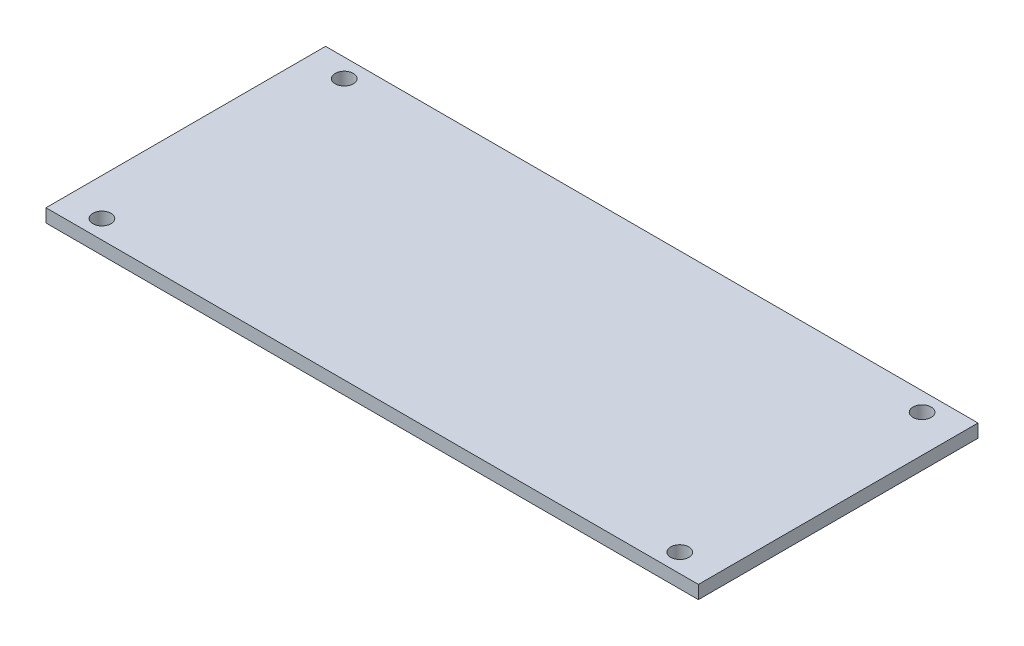
ISO-10303-21;
HEADER;
FILE_DESCRIPTION(('STEP AP214'),'2;1');
FILE_NAME('part.step','',(''),(''),'','','');
FILE_SCHEMA(('AUTOMOTIVE_DESIGN { 1 0 10303 214 1 1 1 1 }'));
ENDSEC;
DATA;
#1=APPLICATION_CONTEXT('core data for automotive mechanical design processes');
#2=APPLICATION_PROTOCOL_DEFINITION('international standard','automotive_design',2000,#1);
#3=PRODUCT_CONTEXT('',#1,'mechanical');
#4=PRODUCT('Part','Part','',(#3));
#5=PRODUCT_RELATED_PRODUCT_CATEGORY('part','',(#4));
#6=PRODUCT_DEFINITION_FORMATION('','',#4);
#7=PRODUCT_DEFINITION_CONTEXT('part definition',#1,'design');
#8=PRODUCT_DEFINITION('design','',#6,#7);
#9=PRODUCT_DEFINITION_SHAPE('','',#8);
#10=(LENGTH_UNIT() NAMED_UNIT(*) SI_UNIT(.MILLI.,.METRE.));
#11=(NAMED_UNIT(*) PLANE_ANGLE_UNIT() SI_UNIT($,.RADIAN.));
#12=(NAMED_UNIT(*) SI_UNIT($,.STERADIAN.) SOLID_ANGLE_UNIT());
#13=UNCERTAINTY_MEASURE_WITH_UNIT(LENGTH_MEASURE(1.E-05),#10,'distance_accuracy_value','');
#14=(GEOMETRIC_REPRESENTATION_CONTEXT(3) GLOBAL_UNCERTAINTY_ASSIGNED_CONTEXT((#13)) GLOBAL_UNIT_ASSIGNED_CONTEXT((#10,
#11,#12)) REPRESENTATION_CONTEXT('',''));
#15=CARTESIAN_POINT('',(0.,0.,0.));
#16=DIRECTION('',(0.,0.,1.));
#17=DIRECTION('',(1.,0.,0.));
#18=AXIS2_PLACEMENT_3D('',#15,#16,#17);
#19=CARTESIAN_POINT('',(0.,1.42,0.));
#20=DIRECTION('',(0.,-1.,0.));
#21=DIRECTION('',(0.,0.,-1.));
#22=AXIS2_PLACEMENT_3D('',#19,#20,#21);
#23=PLANE('',#22);
#24=DIRECTION('',(0.,0.,-1.));
#25=VECTOR('',#24,1.);
#26=CARTESIAN_POINT('',(35.,1.42,15.));
#27=LINE('',#26,#25);
#28=CARTESIAN_POINT('',(35.,1.42,15.));
#29=VERTEX_POINT('',#28);
#30=CARTESIAN_POINT('',(35.,1.42,-15.));
#31=VERTEX_POINT('',#30);
#32=EDGE_CURVE('E85',#29,#31,#27,.T.);
#33=ORIENTED_EDGE('',*,*,#32,.T.);
#34=DIRECTION('',(-1.,0.,0.));
#35=VECTOR('',#34,1.);
#36=CARTESIAN_POINT('',(-35.,1.42,-15.));
#37=LINE('',#36,#35);
#38=CARTESIAN_POINT('',(-35.,1.42,-15.));
#39=VERTEX_POINT('',#38);
#40=EDGE_CURVE('E80',#31,#39,#37,.T.);
#41=ORIENTED_EDGE('',*,*,#40,.T.);
#42=DIRECTION('',(0.,0.,1.));
#43=VECTOR('',#42,1.);
#44=CARTESIAN_POINT('',(-35.,1.42,15.));
#45=LINE('',#44,#43);
#46=CARTESIAN_POINT('',(-35.,1.42,15.));
#47=VERTEX_POINT('',#46);
#48=EDGE_CURVE('E83',#39,#47,#45,.T.);
#49=ORIENTED_EDGE('',*,*,#48,.T.);
#50=DIRECTION('',(1.,0.,0.));
#51=VECTOR('',#50,1.);
#52=CARTESIAN_POINT('',(-35.,1.42,15.));
#53=LINE('',#52,#51);
#54=EDGE_CURVE('E50',#47,#29,#53,.T.);
#55=ORIENTED_EDGE('',*,*,#54,.T.);
#56=EDGE_LOOP('',(#33,#41,#49,#55));
#57=FACE_BOUND('',#56,.T.);
#58=CARTESIAN_POINT('',(-31.,1.42,-13.));
#59=DIRECTION('',(0.,1.,0.));
#60=DIRECTION('',(0.,0.,1.));
#61=AXIS2_PLACEMENT_3D('',#58,#59,#60);
#62=CIRCLE('',#61,0.975);
#63=CARTESIAN_POINT('',(-31.,1.42,-13.975));
#64=VERTEX_POINT('',#63);
#65=EDGE_CURVE('E100',#64,#64,#62,.T.);
#66=ORIENTED_EDGE('',*,*,#65,.F.);
#67=EDGE_LOOP('',(#66));
#68=FACE_BOUND('',#67,.T.);
#69=CARTESIAN_POINT('',(31.,1.42,-13.));
#70=DIRECTION('',(0.,1.,0.));
#71=DIRECTION('',(0.,0.,1.));
#72=AXIS2_PLACEMENT_3D('',#69,#70,#71);
#73=CIRCLE('',#72,0.975000000000003);
#74=CARTESIAN_POINT('',(31.,1.42,-13.975));
#75=VERTEX_POINT('',#74);
#76=EDGE_CURVE('E115',#75,#75,#73,.T.);
#77=ORIENTED_EDGE('',*,*,#76,.F.);
#78=EDGE_LOOP('',(#77));
#79=FACE_BOUND('',#78,.T.);
#80=CARTESIAN_POINT('',(31.,1.42,13.));
#81=DIRECTION('',(0.,1.,0.));
#82=DIRECTION('',(0.,0.,1.));
#83=AXIS2_PLACEMENT_3D('',#80,#81,#82);
#84=CIRCLE('',#83,0.975000000000003);
#85=CARTESIAN_POINT('',(31.,1.42,12.025));
#86=VERTEX_POINT('',#85);
#87=EDGE_CURVE('E121',#86,#86,#84,.T.);
#88=ORIENTED_EDGE('',*,*,#87,.F.);
#89=EDGE_LOOP('',(#88));
#90=FACE_BOUND('',#89,.T.);
#91=CARTESIAN_POINT('',(-31.,1.42,13.));
#92=DIRECTION('',(0.,1.,0.));
#93=DIRECTION('',(0.,0.,1.));
#94=AXIS2_PLACEMENT_3D('',#91,#92,#93);
#95=CIRCLE('',#94,0.975);
#96=CARTESIAN_POINT('',(-31.,1.42,12.025));
#97=VERTEX_POINT('',#96);
#98=EDGE_CURVE('E127',#97,#97,#95,.T.);
#99=ORIENTED_EDGE('',*,*,#98,.F.);
#100=EDGE_LOOP('',(#99));
#101=FACE_BOUND('',#100,.T.);
#102=ADVANCED_FACE('F33',(#57,#68,#79,#90,#101),#23,.F.);
#103=CARTESIAN_POINT('',(0.,0.,0.));
#104=DIRECTION('',(0.,-1.,0.));
#105=DIRECTION('',(0.,0.,-1.));
#106=AXIS2_PLACEMENT_3D('',#103,#104,#105);
#107=PLANE('',#106);
#108=CARTESIAN_POINT('',(31.,0.,13.));
#109=DIRECTION('',(0.,1.,0.));
#110=DIRECTION('',(0.,0.,1.));
#111=AXIS2_PLACEMENT_3D('',#108,#109,#110);
#112=CIRCLE('',#111,0.975000000000003);
#113=CARTESIAN_POINT('',(31.,0.,12.025));
#114=VERTEX_POINT('',#113);
#115=EDGE_CURVE('E124',#114,#114,#112,.T.);
#116=ORIENTED_EDGE('',*,*,#115,.T.);
#117=EDGE_LOOP('',(#116));
#118=FACE_BOUND('',#117,.T.);
#119=CARTESIAN_POINT('',(-31.,0.,-13.));
#120=DIRECTION('',(0.,1.,0.));
#121=DIRECTION('',(0.,0.,1.));
#122=AXIS2_PLACEMENT_3D('',#119,#120,#121);
#123=CIRCLE('',#122,0.975);
#124=CARTESIAN_POINT('',(-31.,0.,-13.975));
#125=VERTEX_POINT('',#124);
#126=EDGE_CURVE('E112',#125,#125,#123,.T.);
#127=ORIENTED_EDGE('',*,*,#126,.T.);
#128=EDGE_LOOP('',(#127));
#129=FACE_BOUND('',#128,.T.);
#130=DIRECTION('',(0.,0.,-1.));
#131=VECTOR('',#130,1.);
#132=CARTESIAN_POINT('',(35.,0.,15.));
#133=LINE('',#132,#131);
#134=CARTESIAN_POINT('',(35.,0.,15.));
#135=VERTEX_POINT('',#134);
#136=CARTESIAN_POINT('',(35.,0.,-15.));
#137=VERTEX_POINT('',#136);
#138=EDGE_CURVE('E97',#135,#137,#133,.T.);
#139=ORIENTED_EDGE('',*,*,#138,.F.);
#140=DIRECTION('',(1.,0.,0.));
#141=VECTOR('',#140,1.);
#142=CARTESIAN_POINT('',(-35.,0.,15.));
#143=LINE('',#142,#141);
#144=CARTESIAN_POINT('',(-35.,0.,15.));
#145=VERTEX_POINT('',#144);
#146=EDGE_CURVE('E73',#145,#135,#143,.T.);
#147=ORIENTED_EDGE('',*,*,#146,.F.);
#148=DIRECTION('',(0.,0.,1.));
#149=VECTOR('',#148,1.);
#150=CARTESIAN_POINT('',(-35.,0.,15.));
#151=LINE('',#150,#149);
#152=CARTESIAN_POINT('',(-35.,0.,-15.));
#153=VERTEX_POINT('',#152);
#154=EDGE_CURVE('E67',#153,#145,#151,.T.);
#155=ORIENTED_EDGE('',*,*,#154,.F.);
#156=DIRECTION('',(-1.,0.,0.));
#157=VECTOR('',#156,1.);
#158=CARTESIAN_POINT('',(-35.,0.,-15.));
#159=LINE('',#158,#157);
#160=EDGE_CURVE('E89',#137,#153,#159,.T.);
#161=ORIENTED_EDGE('',*,*,#160,.F.);
#162=EDGE_LOOP('',(#139,#147,#155,#161));
#163=FACE_BOUND('',#162,.T.);
#164=CARTESIAN_POINT('',(31.,0.,-13.));
#165=DIRECTION('',(0.,1.,0.));
#166=DIRECTION('',(0.,0.,1.));
#167=AXIS2_PLACEMENT_3D('',#164,#165,#166);
#168=CIRCLE('',#167,0.975000000000003);
#169=CARTESIAN_POINT('',(31.,0.,-13.975));
#170=VERTEX_POINT('',#169);
#171=EDGE_CURVE('E118',#170,#170,#168,.T.);
#172=ORIENTED_EDGE('',*,*,#171,.T.);
#173=EDGE_LOOP('',(#172));
#174=FACE_BOUND('',#173,.T.);
#175=CARTESIAN_POINT('',(-31.,0.,13.));
#176=DIRECTION('',(0.,1.,0.));
#177=DIRECTION('',(0.,0.,1.));
#178=AXIS2_PLACEMENT_3D('',#175,#176,#177);
#179=CIRCLE('',#178,0.975);
#180=CARTESIAN_POINT('',(-31.,0.,12.025));
#181=VERTEX_POINT('',#180);
#182=EDGE_CURVE('E130',#181,#181,#179,.T.);
#183=ORIENTED_EDGE('',*,*,#182,.T.);
#184=EDGE_LOOP('',(#183));
#185=FACE_BOUND('',#184,.T.);
#186=ADVANCED_FACE('F108',(#118,#129,#163,#174,#185),#107,.T.);
#187=CARTESIAN_POINT('',(35.,1.42,15.));
#188=DIRECTION('',(-1.,0.,0.));
#189=DIRECTION('',(0.,0.,1.));
#190=AXIS2_PLACEMENT_3D('',#187,#188,#189);
#191=PLANE('',#190);
#192=ORIENTED_EDGE('',*,*,#138,.T.);
#193=DIRECTION('',(0.,-1.,0.));
#194=VECTOR('',#193,1.);
#195=CARTESIAN_POINT('',(35.,1.42,-15.));
#196=LINE('',#195,#194);
#197=EDGE_CURVE('E11',#31,#137,#196,.T.);
#198=ORIENTED_EDGE('',*,*,#197,.F.);
#199=ORIENTED_EDGE('',*,*,#32,.F.);
#200=DIRECTION('',(0.,-1.,0.));
#201=VECTOR('',#200,1.);
#202=CARTESIAN_POINT('',(35.,1.42,15.));
#203=LINE('',#202,#201);
#204=EDGE_CURVE('E93',#29,#135,#203,.T.);
#205=ORIENTED_EDGE('',*,*,#204,.T.);
#206=EDGE_LOOP('',(#192,#198,#199,#205));
#207=FACE_BOUND('',#206,.T.);
#208=ADVANCED_FACE('F35',(#207),#191,.F.);
#209=CARTESIAN_POINT('',(-35.,1.42,-15.));
#210=DIRECTION('',(0.,0.,1.));
#211=DIRECTION('',(1.,0.,0.));
#212=AXIS2_PLACEMENT_3D('',#209,#210,#211);
#213=PLANE('',#212);
#214=ORIENTED_EDGE('',*,*,#160,.T.);
#215=DIRECTION('',(0.,-1.,0.));
#216=VECTOR('',#215,1.);
#217=CARTESIAN_POINT('',(-35.,1.42,-15.));
#218=LINE('',#217,#216);
#219=EDGE_CURVE('E42',#39,#153,#218,.T.);
#220=ORIENTED_EDGE('',*,*,#219,.F.);
#221=ORIENTED_EDGE('',*,*,#40,.F.);
#222=ORIENTED_EDGE('',*,*,#197,.T.);
#223=EDGE_LOOP('',(#214,#220,#221,#222));
#224=FACE_BOUND('',#223,.T.);
#225=ADVANCED_FACE('F88',(#224),#213,.F.);
#226=CARTESIAN_POINT('',(-35.,1.42,15.));
#227=DIRECTION('',(1.,0.,0.));
#228=DIRECTION('',(0.,0.,-1.));
#229=AXIS2_PLACEMENT_3D('',#226,#227,#228);
#230=PLANE('',#229);
#231=ORIENTED_EDGE('',*,*,#154,.T.);
#232=DIRECTION('',(0.,-1.,0.));
#233=VECTOR('',#232,1.);
#234=CARTESIAN_POINT('',(-35.,1.42,15.));
#235=LINE('',#234,#233);
#236=EDGE_CURVE('E90',#47,#145,#235,.T.);
#237=ORIENTED_EDGE('',*,*,#236,.F.);
#238=ORIENTED_EDGE('',*,*,#48,.F.);
#239=ORIENTED_EDGE('',*,*,#219,.T.);
#240=EDGE_LOOP('',(#231,#237,#238,#239));
#241=FACE_BOUND('',#240,.T.);
#242=ADVANCED_FACE('F91',(#241),#230,.F.);
#243=CARTESIAN_POINT('',(-35.,1.42,15.));
#244=DIRECTION('',(0.,0.,-1.));
#245=DIRECTION('',(-1.,0.,0.));
#246=AXIS2_PLACEMENT_3D('',#243,#244,#245);
#247=PLANE('',#246);
#248=ORIENTED_EDGE('',*,*,#146,.T.);
#249=ORIENTED_EDGE('',*,*,#204,.F.);
#250=ORIENTED_EDGE('',*,*,#54,.F.);
#251=ORIENTED_EDGE('',*,*,#236,.T.);
#252=EDGE_LOOP('',(#248,#249,#250,#251));
#253=FACE_BOUND('',#252,.T.);
#254=ADVANCED_FACE('F105',(#253),#247,.F.);
#255=CARTESIAN_POINT('',(-31.,1.42,-13.));
#256=DIRECTION('',(0.,-1.,0.));
#257=DIRECTION('',(0.,0.,-1.));
#258=AXIS2_PLACEMENT_3D('',#255,#256,#257);
#259=CYLINDRICAL_SURFACE('',#258,0.975);
#260=CARTESIAN_POINT('',(-31.,1.42,-13.975));
#261=CARTESIAN_POINT('',(-31.,1.40520833333333,-13.975));
#262=CARTESIAN_POINT('',(-31.,1.39041666666667,-13.975));
#263=CARTESIAN_POINT('',(-31.,1.36083333333333,-13.975));
#264=CARTESIAN_POINT('',(-31.,1.34604166666667,-13.975));
#265=CARTESIAN_POINT('',(-31.,1.31645833333333,-13.975));
#266=CARTESIAN_POINT('',(-31.,1.30166666666667,-13.975));
#267=CARTESIAN_POINT('',(-31.,1.27208333333333,-13.975));
#268=CARTESIAN_POINT('',(-31.,1.25729166666667,-13.975));
#269=CARTESIAN_POINT('',(-31.,1.22770833333333,-13.975));
#270=CARTESIAN_POINT('',(-31.,1.21291666666667,-13.975));
#271=CARTESIAN_POINT('',(-31.,1.18333333333333,-13.975));
#272=CARTESIAN_POINT('',(-31.,1.16854166666667,-13.975));
#273=CARTESIAN_POINT('',(-31.,1.13895833333333,-13.975));
#274=CARTESIAN_POINT('',(-31.,1.12416666666667,-13.975));
#275=CARTESIAN_POINT('',(-31.,1.09458333333333,-13.975));
#276=CARTESIAN_POINT('',(-31.,1.07979166666667,-13.975));
#277=CARTESIAN_POINT('',(-31.,1.05020833333333,-13.975));
#278=CARTESIAN_POINT('',(-31.,1.03541666666667,-13.975));
#279=CARTESIAN_POINT('',(-31.,1.00583333333333,-13.975));
#280=CARTESIAN_POINT('',(-31.,0.991041666666666,-13.975));
#281=CARTESIAN_POINT('',(-31.,0.961458333333333,-13.975));
#282=CARTESIAN_POINT('',(-31.,0.946666666666666,-13.975));
#283=CARTESIAN_POINT('',(-31.,0.917083333333333,-13.975));
#284=CARTESIAN_POINT('',(-31.,0.902291666666666,-13.975));
#285=CARTESIAN_POINT('',(-31.,0.872708333333333,-13.975));
#286=CARTESIAN_POINT('',(-31.,0.857916666666666,-13.975));
#287=CARTESIAN_POINT('',(-31.,0.828333333333333,-13.975));
#288=CARTESIAN_POINT('',(-31.,0.813541666666666,-13.975));
#289=CARTESIAN_POINT('',(-31.,0.783958333333333,-13.975));
#290=CARTESIAN_POINT('',(-31.,0.769166666666666,-13.975));
#291=CARTESIAN_POINT('',(-31.,0.739583333333333,-13.975));
#292=CARTESIAN_POINT('',(-31.,0.724791666666666,-13.975));
#293=CARTESIAN_POINT('',(-31.,0.695208333333333,-13.975));
#294=CARTESIAN_POINT('',(-31.,0.680416666666666,-13.975));
#295=CARTESIAN_POINT('',(-31.,0.650833333333333,-13.975));
#296=CARTESIAN_POINT('',(-31.,0.636041666666666,-13.975));
#297=CARTESIAN_POINT('',(-31.,0.606458333333333,-13.975));
#298=CARTESIAN_POINT('',(-31.,0.591666666666666,-13.975));
#299=CARTESIAN_POINT('',(-31.,0.562083333333333,-13.975));
#300=CARTESIAN_POINT('',(-31.,0.547291666666666,-13.975));
#301=CARTESIAN_POINT('',(-31.,0.517708333333333,-13.975));
#302=CARTESIAN_POINT('',(-31.,0.502916666666666,-13.975));
#303=CARTESIAN_POINT('',(-31.,0.473333333333333,-13.975));
#304=CARTESIAN_POINT('',(-31.,0.458541666666666,-13.975));
#305=CARTESIAN_POINT('',(-31.,0.428958333333333,-13.975));
#306=CARTESIAN_POINT('',(-31.,0.414166666666666,-13.975));
#307=CARTESIAN_POINT('',(-31.,0.384583333333333,-13.975));
#308=CARTESIAN_POINT('',(-31.,0.369791666666666,-13.975));
#309=CARTESIAN_POINT('',(-31.,0.340208333333333,-13.975));
#310=CARTESIAN_POINT('',(-31.,0.325416666666667,-13.975));
#311=CARTESIAN_POINT('',(-31.,0.295833333333333,-13.975));
#312=CARTESIAN_POINT('',(-31.,0.281041666666666,-13.975));
#313=CARTESIAN_POINT('',(-31.,0.251458333333333,-13.975));
#314=CARTESIAN_POINT('',(-31.,0.236666666666666,-13.975));
#315=CARTESIAN_POINT('',(-31.,0.207083333333333,-13.975));
#316=CARTESIAN_POINT('',(-31.,0.192291666666667,-13.975));
#317=CARTESIAN_POINT('',(-31.,0.162708333333333,-13.975));
#318=CARTESIAN_POINT('',(-31.,0.147916666666667,-13.975));
#319=CARTESIAN_POINT('',(-31.,0.118333333333333,-13.975));
#320=CARTESIAN_POINT('',(-31.,0.103541666666666,-13.975));
#321=CARTESIAN_POINT('',(-31.,0.0739583333333331,-13.975));
#322=CARTESIAN_POINT('',(-31.,0.0591666666666664,-13.975));
#323=CARTESIAN_POINT('',(-31.,0.0295833333333331,-13.975));
#324=CARTESIAN_POINT('',(-31.,0.0147916666666664,-13.975));
#325=CARTESIAN_POINT('',(-31.,0.,-13.975));
#326=B_SPLINE_CURVE_WITH_KNOTS('',3,(#260,#261,#262,#263,#264,#265,#266,#267,#268,#269,#270,
#271,#272,#273,#274,#275,#276,#277,#278,#279,#280,#281,#282,#283,#284,#285,#286,#287,#288,#289,
#290,#291,#292,#293,#294,#295,#296,#297,#298,#299,#300,#301,#302,#303,#304,#305,#306,#307,#308,
#309,#310,#311,#312,#313,#314,#315,#316,#317,#318,#319,#320,#321,#322,#323,#324,#325),
.UNSPECIFIED.,.F.,.F.,(4,2,2,2,2,2,2,2,2,2,2,2,2,2,2,2,2,2,2,2,2,2,2,2,2,2,2,2,2,2,2,2,4),(0.,
0.0443750000000001,0.0887500000000001,0.133125,0.1775,0.221875,0.26625,0.310625,0.355,0.399375,
0.44375,0.488125,0.5325,0.576875,0.62125,0.665625,0.71,0.754375,0.79875,0.843125,0.8875,
0.931875,0.97625,1.020625,1.065,1.109375,1.15375,1.198125,1.2425,1.286875,1.33125,1.375625,
1.42),.UNSPECIFIED.);
#327=EDGE_CURVE('BSEAM147',#64,#125,#326,.T.);
#328=ORIENTED_EDGE('',*,*,#65,.T.);
#329=ORIENTED_EDGE('',*,*,#126,.F.);
#330=ORIENTED_EDGE('',*,*,#327,.T.);
#331=ORIENTED_EDGE('',*,*,#327,.F.);
#332=EDGE_LOOP('',(#328,#330,#329,#331));
#333=FACE_BOUND('',#332,.T.);
#334=ADVANCED_FACE('F147',(#333),#259,.F.);
#335=CARTESIAN_POINT('',(31.,1.42,-13.));
#336=DIRECTION('',(0.,-1.,0.));
#337=DIRECTION('',(0.,0.,-1.));
#338=AXIS2_PLACEMENT_3D('',#335,#336,#337);
#339=CYLINDRICAL_SURFACE('',#338,0.975000000000003);
#340=CARTESIAN_POINT('',(31.,1.42,-13.975));
#341=CARTESIAN_POINT('',(31.,1.40520833333333,-13.975));
#342=CARTESIAN_POINT('',(31.,1.39041666666667,-13.975));
#343=CARTESIAN_POINT('',(31.,1.36083333333333,-13.975));
#344=CARTESIAN_POINT('',(31.,1.34604166666667,-13.975));
#345=CARTESIAN_POINT('',(31.,1.31645833333333,-13.975));
#346=CARTESIAN_POINT('',(31.,1.30166666666667,-13.975));
#347=CARTESIAN_POINT('',(31.,1.27208333333333,-13.975));
#348=CARTESIAN_POINT('',(31.,1.25729166666667,-13.975));
#349=CARTESIAN_POINT('',(31.,1.22770833333333,-13.975));
#350=CARTESIAN_POINT('',(31.,1.21291666666667,-13.975));
#351=CARTESIAN_POINT('',(31.,1.18333333333333,-13.975));
#352=CARTESIAN_POINT('',(31.,1.16854166666667,-13.975));
#353=CARTESIAN_POINT('',(31.,1.13895833333333,-13.975));
#354=CARTESIAN_POINT('',(31.,1.12416666666667,-13.975));
#355=CARTESIAN_POINT('',(31.,1.09458333333333,-13.975));
#356=CARTESIAN_POINT('',(31.,1.07979166666667,-13.975));
#357=CARTESIAN_POINT('',(31.,1.05020833333333,-13.975));
#358=CARTESIAN_POINT('',(31.,1.03541666666667,-13.975));
#359=CARTESIAN_POINT('',(31.,1.00583333333333,-13.975));
#360=CARTESIAN_POINT('',(31.,0.991041666666666,-13.975));
#361=CARTESIAN_POINT('',(31.,0.961458333333333,-13.975));
#362=CARTESIAN_POINT('',(31.,0.946666666666666,-13.975));
#363=CARTESIAN_POINT('',(31.,0.917083333333333,-13.975));
#364=CARTESIAN_POINT('',(31.,0.902291666666666,-13.975));
#365=CARTESIAN_POINT('',(31.,0.872708333333333,-13.975));
#366=CARTESIAN_POINT('',(31.,0.857916666666666,-13.975));
#367=CARTESIAN_POINT('',(31.,0.828333333333333,-13.975));
#368=CARTESIAN_POINT('',(31.,0.813541666666666,-13.975));
#369=CARTESIAN_POINT('',(31.,0.783958333333333,-13.975));
#370=CARTESIAN_POINT('',(31.,0.769166666666666,-13.975));
#371=CARTESIAN_POINT('',(31.,0.739583333333333,-13.975));
#372=CARTESIAN_POINT('',(31.,0.724791666666666,-13.975));
#373=CARTESIAN_POINT('',(31.,0.695208333333333,-13.975));
#374=CARTESIAN_POINT('',(31.,0.680416666666666,-13.975));
#375=CARTESIAN_POINT('',(31.,0.650833333333333,-13.975));
#376=CARTESIAN_POINT('',(31.,0.636041666666666,-13.975));
#377=CARTESIAN_POINT('',(31.,0.606458333333333,-13.975));
#378=CARTESIAN_POINT('',(31.,0.591666666666666,-13.975));
#379=CARTESIAN_POINT('',(31.,0.562083333333333,-13.975));
#380=CARTESIAN_POINT('',(31.,0.547291666666666,-13.975));
#381=CARTESIAN_POINT('',(31.,0.517708333333333,-13.975));
#382=CARTESIAN_POINT('',(31.,0.502916666666666,-13.975));
#383=CARTESIAN_POINT('',(31.,0.473333333333333,-13.975));
#384=CARTESIAN_POINT('',(31.,0.458541666666666,-13.975));
#385=CARTESIAN_POINT('',(31.,0.428958333333333,-13.975));
#386=CARTESIAN_POINT('',(31.,0.414166666666666,-13.975));
#387=CARTESIAN_POINT('',(31.,0.384583333333333,-13.975));
#388=CARTESIAN_POINT('',(31.,0.369791666666666,-13.975));
#389=CARTESIAN_POINT('',(31.,0.340208333333333,-13.975));
#390=CARTESIAN_POINT('',(31.,0.325416666666667,-13.975));
#391=CARTESIAN_POINT('',(31.,0.295833333333333,-13.975));
#392=CARTESIAN_POINT('',(31.,0.281041666666666,-13.975));
#393=CARTESIAN_POINT('',(31.,0.251458333333333,-13.975));
#394=CARTESIAN_POINT('',(31.,0.236666666666666,-13.975));
#395=CARTESIAN_POINT('',(31.,0.207083333333333,-13.975));
#396=CARTESIAN_POINT('',(31.,0.192291666666667,-13.975));
#397=CARTESIAN_POINT('',(31.,0.162708333333333,-13.975));
#398=CARTESIAN_POINT('',(31.,0.147916666666667,-13.975));
#399=CARTESIAN_POINT('',(31.,0.118333333333333,-13.975));
#400=CARTESIAN_POINT('',(31.,0.103541666666666,-13.975));
#401=CARTESIAN_POINT('',(31.,0.0739583333333331,-13.975));
#402=CARTESIAN_POINT('',(31.,0.0591666666666664,-13.975));
#403=CARTESIAN_POINT('',(31.,0.0295833333333331,-13.975));
#404=CARTESIAN_POINT('',(31.,0.0147916666666664,-13.975));
#405=CARTESIAN_POINT('',(31.,0.,-13.975));
#406=B_SPLINE_CURVE_WITH_KNOTS('',3,(#340,#341,#342,#343,#344,#345,#346,#347,#348,#349,#350,
#351,#352,#353,#354,#355,#356,#357,#358,#359,#360,#361,#362,#363,#364,#365,#366,#367,#368,#369,
#370,#371,#372,#373,#374,#375,#376,#377,#378,#379,#380,#381,#382,#383,#384,#385,#386,#387,#388,
#389,#390,#391,#392,#393,#394,#395,#396,#397,#398,#399,#400,#401,#402,#403,#404,#405),
.UNSPECIFIED.,.F.,.F.,(4,2,2,2,2,2,2,2,2,2,2,2,2,2,2,2,2,2,2,2,2,2,2,2,2,2,2,2,2,2,2,2,4),(0.,
0.0443750000000001,0.0887500000000001,0.133125,0.1775,0.221875,0.26625,0.310625,0.355,0.399375,
0.44375,0.488125,0.5325,0.576875,0.62125,0.665625,0.71,0.754375,0.79875,0.843125,0.8875,
0.931875,0.97625,1.020625,1.065,1.109375,1.15375,1.198125,1.2425,1.286875,1.33125,1.375625,
1.42),.UNSPECIFIED.);
#407=EDGE_CURVE('BSEAM193',#75,#170,#406,.T.);
#408=ORIENTED_EDGE('',*,*,#76,.T.);
#409=ORIENTED_EDGE('',*,*,#171,.F.);
#410=ORIENTED_EDGE('',*,*,#407,.T.);
#411=ORIENTED_EDGE('',*,*,#407,.F.);
#412=EDGE_LOOP('',(#408,#410,#409,#411));
#413=FACE_BOUND('',#412,.T.);
#414=ADVANCED_FACE('F193',(#413),#339,.F.);
#415=CARTESIAN_POINT('',(31.,1.42,13.));
#416=DIRECTION('',(0.,-1.,0.));
#417=DIRECTION('',(0.,0.,-1.));
#418=AXIS2_PLACEMENT_3D('',#415,#416,#417);
#419=CYLINDRICAL_SURFACE('',#418,0.975000000000003);
#420=CARTESIAN_POINT('',(31.,1.42,12.025));
#421=CARTESIAN_POINT('',(31.,1.40520833333333,12.025));
#422=CARTESIAN_POINT('',(31.,1.39041666666667,12.025));
#423=CARTESIAN_POINT('',(31.,1.36083333333333,12.025));
#424=CARTESIAN_POINT('',(31.,1.34604166666667,12.025));
#425=CARTESIAN_POINT('',(31.,1.31645833333333,12.025));
#426=CARTESIAN_POINT('',(31.,1.30166666666667,12.025));
#427=CARTESIAN_POINT('',(31.,1.27208333333333,12.025));
#428=CARTESIAN_POINT('',(31.,1.25729166666667,12.025));
#429=CARTESIAN_POINT('',(31.,1.22770833333333,12.025));
#430=CARTESIAN_POINT('',(31.,1.21291666666667,12.025));
#431=CARTESIAN_POINT('',(31.,1.18333333333333,12.025));
#432=CARTESIAN_POINT('',(31.,1.16854166666667,12.025));
#433=CARTESIAN_POINT('',(31.,1.13895833333333,12.025));
#434=CARTESIAN_POINT('',(31.,1.12416666666667,12.025));
#435=CARTESIAN_POINT('',(31.,1.09458333333333,12.025));
#436=CARTESIAN_POINT('',(31.,1.07979166666667,12.025));
#437=CARTESIAN_POINT('',(31.,1.05020833333333,12.025));
#438=CARTESIAN_POINT('',(31.,1.03541666666667,12.025));
#439=CARTESIAN_POINT('',(31.,1.00583333333333,12.025));
#440=CARTESIAN_POINT('',(31.,0.991041666666666,12.025));
#441=CARTESIAN_POINT('',(31.,0.961458333333333,12.025));
#442=CARTESIAN_POINT('',(31.,0.946666666666666,12.025));
#443=CARTESIAN_POINT('',(31.,0.917083333333333,12.025));
#444=CARTESIAN_POINT('',(31.,0.902291666666666,12.025));
#445=CARTESIAN_POINT('',(31.,0.872708333333333,12.025));
#446=CARTESIAN_POINT('',(31.,0.857916666666666,12.025));
#447=CARTESIAN_POINT('',(31.,0.828333333333333,12.025));
#448=CARTESIAN_POINT('',(31.,0.813541666666666,12.025));
#449=CARTESIAN_POINT('',(31.,0.783958333333333,12.025));
#450=CARTESIAN_POINT('',(31.,0.769166666666666,12.025));
#451=CARTESIAN_POINT('',(31.,0.739583333333333,12.025));
#452=CARTESIAN_POINT('',(31.,0.724791666666666,12.025));
#453=CARTESIAN_POINT('',(31.,0.695208333333333,12.025));
#454=CARTESIAN_POINT('',(31.,0.680416666666666,12.025));
#455=CARTESIAN_POINT('',(31.,0.650833333333333,12.025));
#456=CARTESIAN_POINT('',(31.,0.636041666666666,12.025));
#457=CARTESIAN_POINT('',(31.,0.606458333333333,12.025));
#458=CARTESIAN_POINT('',(31.,0.591666666666666,12.025));
#459=CARTESIAN_POINT('',(31.,0.562083333333333,12.025));
#460=CARTESIAN_POINT('',(31.,0.547291666666666,12.025));
#461=CARTESIAN_POINT('',(31.,0.517708333333333,12.025));
#462=CARTESIAN_POINT('',(31.,0.502916666666666,12.025));
#463=CARTESIAN_POINT('',(31.,0.473333333333333,12.025));
#464=CARTESIAN_POINT('',(31.,0.458541666666666,12.025));
#465=CARTESIAN_POINT('',(31.,0.428958333333333,12.025));
#466=CARTESIAN_POINT('',(31.,0.414166666666666,12.025));
#467=CARTESIAN_POINT('',(31.,0.384583333333333,12.025));
#468=CARTESIAN_POINT('',(31.,0.369791666666666,12.025));
#469=CARTESIAN_POINT('',(31.,0.340208333333333,12.025));
#470=CARTESIAN_POINT('',(31.,0.325416666666667,12.025));
#471=CARTESIAN_POINT('',(31.,0.295833333333333,12.025));
#472=CARTESIAN_POINT('',(31.,0.281041666666666,12.025));
#473=CARTESIAN_POINT('',(31.,0.251458333333333,12.025));
#474=CARTESIAN_POINT('',(31.,0.236666666666666,12.025));
#475=CARTESIAN_POINT('',(31.,0.207083333333333,12.025));
#476=CARTESIAN_POINT('',(31.,0.192291666666667,12.025));
#477=CARTESIAN_POINT('',(31.,0.162708333333333,12.025));
#478=CARTESIAN_POINT('',(31.,0.147916666666667,12.025));
#479=CARTESIAN_POINT('',(31.,0.118333333333333,12.025));
#480=CARTESIAN_POINT('',(31.,0.103541666666666,12.025));
#481=CARTESIAN_POINT('',(31.,0.0739583333333331,12.025));
#482=CARTESIAN_POINT('',(31.,0.0591666666666664,12.025));
#483=CARTESIAN_POINT('',(31.,0.0295833333333331,12.025));
#484=CARTESIAN_POINT('',(31.,0.0147916666666664,12.025));
#485=CARTESIAN_POINT('',(31.,0.,12.025));
#486=B_SPLINE_CURVE_WITH_KNOTS('',3,(#420,#421,#422,#423,#424,#425,#426,#427,#428,#429,#430,
#431,#432,#433,#434,#435,#436,#437,#438,#439,#440,#441,#442,#443,#444,#445,#446,#447,#448,#449,
#450,#451,#452,#453,#454,#455,#456,#457,#458,#459,#460,#461,#462,#463,#464,#465,#466,#467,#468,
#469,#470,#471,#472,#473,#474,#475,#476,#477,#478,#479,#480,#481,#482,#483,#484,#485),
.UNSPECIFIED.,.F.,.F.,(4,2,2,2,2,2,2,2,2,2,2,2,2,2,2,2,2,2,2,2,2,2,2,2,2,2,2,2,2,2,2,2,4),(0.,
0.0443750000000001,0.0887500000000001,0.133125,0.1775,0.221875,0.26625,0.310625,0.355,0.399375,
0.44375,0.488125,0.5325,0.576875,0.62125,0.665625,0.71,0.754375,0.79875,0.843125,0.8875,
0.931875,0.97625,1.020625,1.065,1.109375,1.15375,1.198125,1.2425,1.286875,1.33125,1.375625,
1.42),.UNSPECIFIED.);
#487=EDGE_CURVE('BSEAM201',#86,#114,#486,.T.);
#488=ORIENTED_EDGE('',*,*,#87,.T.);
#489=ORIENTED_EDGE('',*,*,#115,.F.);
#490=ORIENTED_EDGE('',*,*,#487,.T.);
#491=ORIENTED_EDGE('',*,*,#487,.F.);
#492=EDGE_LOOP('',(#488,#490,#489,#491));
#493=FACE_BOUND('',#492,.T.);
#494=ADVANCED_FACE('F201',(#493),#419,.F.);
#495=CARTESIAN_POINT('',(-31.,1.42,13.));
#496=DIRECTION('',(0.,-1.,0.));
#497=DIRECTION('',(0.,0.,-1.));
#498=AXIS2_PLACEMENT_3D('',#495,#496,#497);
#499=CYLINDRICAL_SURFACE('',#498,0.975);
#500=CARTESIAN_POINT('',(-31.,1.42,12.025));
#501=CARTESIAN_POINT('',(-31.,1.40520833333333,12.025));
#502=CARTESIAN_POINT('',(-31.,1.39041666666667,12.025));
#503=CARTESIAN_POINT('',(-31.,1.36083333333333,12.025));
#504=CARTESIAN_POINT('',(-31.,1.34604166666667,12.025));
#505=CARTESIAN_POINT('',(-31.,1.31645833333333,12.025));
#506=CARTESIAN_POINT('',(-31.,1.30166666666667,12.025));
#507=CARTESIAN_POINT('',(-31.,1.27208333333333,12.025));
#508=CARTESIAN_POINT('',(-31.,1.25729166666667,12.025));
#509=CARTESIAN_POINT('',(-31.,1.22770833333333,12.025));
#510=CARTESIAN_POINT('',(-31.,1.21291666666667,12.025));
#511=CARTESIAN_POINT('',(-31.,1.18333333333333,12.025));
#512=CARTESIAN_POINT('',(-31.,1.16854166666667,12.025));
#513=CARTESIAN_POINT('',(-31.,1.13895833333333,12.025));
#514=CARTESIAN_POINT('',(-31.,1.12416666666667,12.025));
#515=CARTESIAN_POINT('',(-31.,1.09458333333333,12.025));
#516=CARTESIAN_POINT('',(-31.,1.07979166666667,12.025));
#517=CARTESIAN_POINT('',(-31.,1.05020833333333,12.025));
#518=CARTESIAN_POINT('',(-31.,1.03541666666667,12.025));
#519=CARTESIAN_POINT('',(-31.,1.00583333333333,12.025));
#520=CARTESIAN_POINT('',(-31.,0.991041666666666,12.025));
#521=CARTESIAN_POINT('',(-31.,0.961458333333333,12.025));
#522=CARTESIAN_POINT('',(-31.,0.946666666666666,12.025));
#523=CARTESIAN_POINT('',(-31.,0.917083333333333,12.025));
#524=CARTESIAN_POINT('',(-31.,0.902291666666666,12.025));
#525=CARTESIAN_POINT('',(-31.,0.872708333333333,12.025));
#526=CARTESIAN_POINT('',(-31.,0.857916666666666,12.025));
#527=CARTESIAN_POINT('',(-31.,0.828333333333333,12.025));
#528=CARTESIAN_POINT('',(-31.,0.813541666666666,12.025));
#529=CARTESIAN_POINT('',(-31.,0.783958333333333,12.025));
#530=CARTESIAN_POINT('',(-31.,0.769166666666666,12.025));
#531=CARTESIAN_POINT('',(-31.,0.739583333333333,12.025));
#532=CARTESIAN_POINT('',(-31.,0.724791666666666,12.025));
#533=CARTESIAN_POINT('',(-31.,0.695208333333333,12.025));
#534=CARTESIAN_POINT('',(-31.,0.680416666666666,12.025));
#535=CARTESIAN_POINT('',(-31.,0.650833333333333,12.025));
#536=CARTESIAN_POINT('',(-31.,0.636041666666666,12.025));
#537=CARTESIAN_POINT('',(-31.,0.606458333333333,12.025));
#538=CARTESIAN_POINT('',(-31.,0.591666666666666,12.025));
#539=CARTESIAN_POINT('',(-31.,0.562083333333333,12.025));
#540=CARTESIAN_POINT('',(-31.,0.547291666666666,12.025));
#541=CARTESIAN_POINT('',(-31.,0.517708333333333,12.025));
#542=CARTESIAN_POINT('',(-31.,0.502916666666666,12.025));
#543=CARTESIAN_POINT('',(-31.,0.473333333333333,12.025));
#544=CARTESIAN_POINT('',(-31.,0.458541666666666,12.025));
#545=CARTESIAN_POINT('',(-31.,0.428958333333333,12.025));
#546=CARTESIAN_POINT('',(-31.,0.414166666666666,12.025));
#547=CARTESIAN_POINT('',(-31.,0.384583333333333,12.025));
#548=CARTESIAN_POINT('',(-31.,0.369791666666666,12.025));
#549=CARTESIAN_POINT('',(-31.,0.340208333333333,12.025));
#550=CARTESIAN_POINT('',(-31.,0.325416666666667,12.025));
#551=CARTESIAN_POINT('',(-31.,0.295833333333333,12.025));
#552=CARTESIAN_POINT('',(-31.,0.281041666666666,12.025));
#553=CARTESIAN_POINT('',(-31.,0.251458333333333,12.025));
#554=CARTESIAN_POINT('',(-31.,0.236666666666666,12.025));
#555=CARTESIAN_POINT('',(-31.,0.207083333333333,12.025));
#556=CARTESIAN_POINT('',(-31.,0.192291666666667,12.025));
#557=CARTESIAN_POINT('',(-31.,0.162708333333333,12.025));
#558=CARTESIAN_POINT('',(-31.,0.147916666666667,12.025));
#559=CARTESIAN_POINT('',(-31.,0.118333333333333,12.025));
#560=CARTESIAN_POINT('',(-31.,0.103541666666666,12.025));
#561=CARTESIAN_POINT('',(-31.,0.0739583333333331,12.025));
#562=CARTESIAN_POINT('',(-31.,0.0591666666666664,12.025));
#563=CARTESIAN_POINT('',(-31.,0.0295833333333331,12.025));
#564=CARTESIAN_POINT('',(-31.,0.0147916666666664,12.025));
#565=CARTESIAN_POINT('',(-31.,0.,12.025));
#566=B_SPLINE_CURVE_WITH_KNOTS('',3,(#500,#501,#502,#503,#504,#505,#506,#507,#508,#509,#510,
#511,#512,#513,#514,#515,#516,#517,#518,#519,#520,#521,#522,#523,#524,#525,#526,#527,#528,#529,
#530,#531,#532,#533,#534,#535,#536,#537,#538,#539,#540,#541,#542,#543,#544,#545,#546,#547,#548,
#549,#550,#551,#552,#553,#554,#555,#556,#557,#558,#559,#560,#561,#562,#563,#564,#565),
.UNSPECIFIED.,.F.,.F.,(4,2,2,2,2,2,2,2,2,2,2,2,2,2,2,2,2,2,2,2,2,2,2,2,2,2,2,2,2,2,2,2,4),(0.,
0.0443750000000001,0.0887500000000001,0.133125,0.1775,0.221875,0.26625,0.310625,0.355,0.399375,
0.44375,0.488125,0.5325,0.576875,0.62125,0.665625,0.71,0.754375,0.79875,0.843125,0.8875,
0.931875,0.97625,1.020625,1.065,1.109375,1.15375,1.198125,1.2425,1.286875,1.33125,1.375625,
1.42),.UNSPECIFIED.);
#567=EDGE_CURVE('BSEAM136',#97,#181,#566,.T.);
#568=ORIENTED_EDGE('',*,*,#98,.T.);
#569=ORIENTED_EDGE('',*,*,#182,.F.);
#570=ORIENTED_EDGE('',*,*,#567,.T.);
#571=ORIENTED_EDGE('',*,*,#567,.F.);
#572=EDGE_LOOP('',(#568,#570,#569,#571));
#573=FACE_BOUND('',#572,.T.);
#574=ADVANCED_FACE('F136',(#573),#499,.F.);
#575=CLOSED_SHELL('',(#102,#186,#208,#225,#242,#254,#334,#414,#494,#574));
#576=MANIFOLD_SOLID_BREP('B2',#575);
#577=ADVANCED_BREP_SHAPE_REPRESENTATION('',(#18,#576),#14);
#578=SHAPE_DEFINITION_REPRESENTATION(#9,#577);
ENDSEC;
END-ISO-10303-21;
